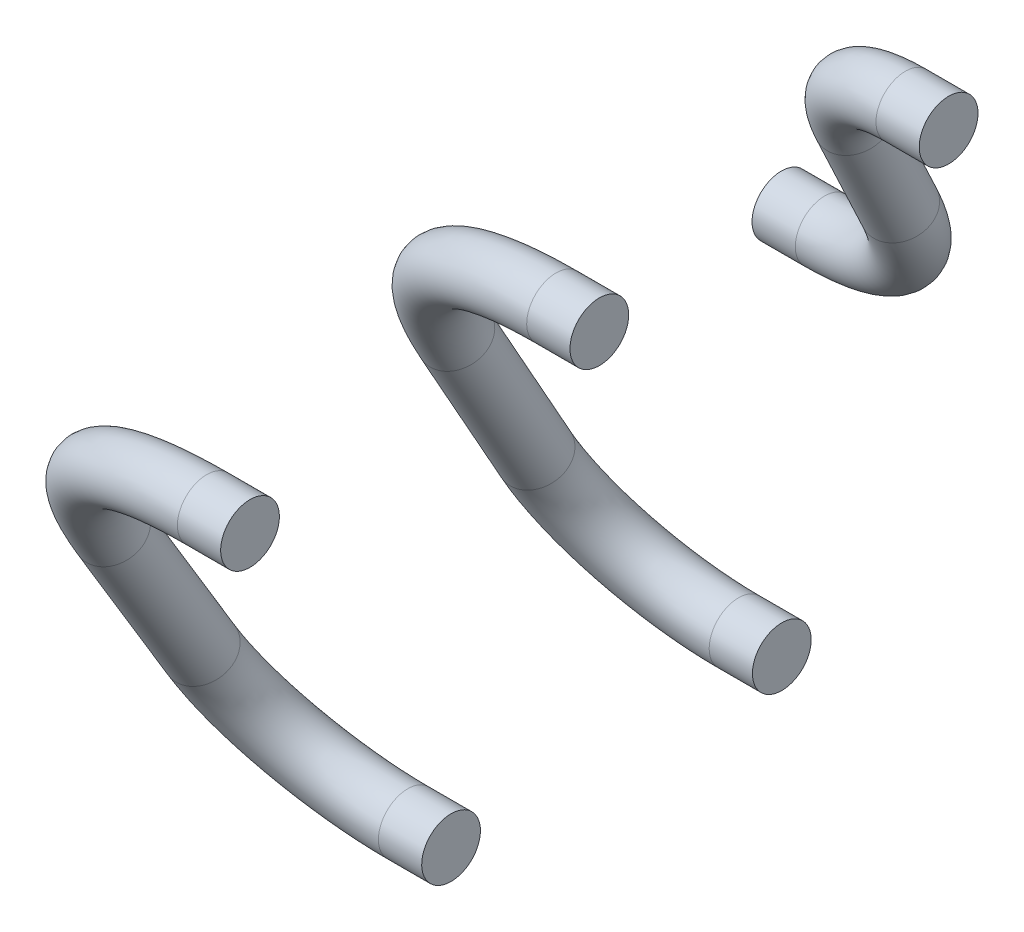
ISO-10303-21;
HEADER;
FILE_DESCRIPTION(('STEP AP214'),'2;1');
FILE_NAME('part.step','',(''),(''),'','','');
FILE_SCHEMA(('AUTOMOTIVE_DESIGN { 1 0 10303 214 1 1 1 1 }'));
ENDSEC;
DATA;
#1=APPLICATION_CONTEXT('core data for automotive mechanical design processes');
#2=APPLICATION_PROTOCOL_DEFINITION('international standard','automotive_design',2000,#1);
#3=PRODUCT_CONTEXT('',#1,'mechanical');
#4=PRODUCT('Part','Part','',(#3));
#5=PRODUCT_RELATED_PRODUCT_CATEGORY('part','',(#4));
#6=PRODUCT_DEFINITION_FORMATION('','',#4);
#7=PRODUCT_DEFINITION_CONTEXT('part definition',#1,'design');
#8=PRODUCT_DEFINITION('design','',#6,#7);
#9=PRODUCT_DEFINITION_SHAPE('','',#8);
#10=(LENGTH_UNIT() NAMED_UNIT(*) SI_UNIT(.MILLI.,.METRE.));
#11=(NAMED_UNIT(*) PLANE_ANGLE_UNIT() SI_UNIT($,.RADIAN.));
#12=(NAMED_UNIT(*) SI_UNIT($,.STERADIAN.) SOLID_ANGLE_UNIT());
#13=UNCERTAINTY_MEASURE_WITH_UNIT(LENGTH_MEASURE(1.E-05),#10,'distance_accuracy_value','');
#14=(GEOMETRIC_REPRESENTATION_CONTEXT(3) GLOBAL_UNCERTAINTY_ASSIGNED_CONTEXT((#13)) GLOBAL_UNIT_ASSIGNED_CONTEXT((#10,
#11,#12)) REPRESENTATION_CONTEXT('',''));
#15=CARTESIAN_POINT('',(0.,0.,0.));
#16=DIRECTION('',(0.,0.,1.));
#17=DIRECTION('',(1.,0.,0.));
#18=AXIS2_PLACEMENT_3D('',#15,#16,#17);
#19=CARTESIAN_POINT('',(-135.683849371952,-35.0000000000001,26.75));
#20=DIRECTION('',(-1.,0.,0.));
#21=DIRECTION('',(0.,0.884808481596098,-0.465954880750923));
#22=AXIS2_PLACEMENT_3D('',#19,#20,#21);
#23=PLANE('',#22);
#24=CARTESIAN_POINT('',(-135.683849371952,-35.0000000000001,26.75));
#25=DIRECTION('',(-1.,0.,0.));
#26=DIRECTION('',(0.,0.884808481596098,-0.465954880750923));
#27=AXIS2_PLACEMENT_3D('',#24,#25,#26);
#28=CIRCLE('',#27,4.75000000000001);
#29=CARTESIAN_POINT('',(-135.683849371952,-30.7971597124186,24.5367143164331));
#30=VERTEX_POINT('',#29);
#31=EDGE_CURVE('E56',#30,#30,#28,.T.);
#32=ORIENTED_EDGE('',*,*,#31,.F.);
#33=EDGE_LOOP('',(#32));
#34=FACE_BOUND('',#33,.T.);
#35=ADVANCED_FACE('F44',(#34),#23,.F.);
#36=CARTESIAN_POINT('',(-125.95,34.9999999999997,69.0000000000001));
#37=DIRECTION('',(1.,0.,0.));
#38=DIRECTION('',(0.,0.,-1.));
#39=AXIS2_PLACEMENT_3D('',#36,#37,#38);
#40=PLANE('',#39);
#41=CARTESIAN_POINT('',(-125.95,34.9999999999997,69.0000000000001));
#42=DIRECTION('',(1.,0.,0.));
#43=DIRECTION('',(0.,0.,-1.));
#44=AXIS2_PLACEMENT_3D('',#41,#42,#43);
#45=CIRCLE('',#44,4.75000000000001);
#46=CARTESIAN_POINT('',(-125.95,34.9999999999997,64.2500000000001));
#47=VERTEX_POINT('',#46);
#48=EDGE_CURVE('E12',#47,#47,#45,.T.);
#49=ORIENTED_EDGE('',*,*,#48,.T.);
#50=EDGE_LOOP('',(#49));
#51=FACE_BOUND('',#50,.T.);
#52=ADVANCED_FACE('F59',(#51),#40,.T.);
#53=CARTESIAN_POINT('',(-135.683849371952,-35.0000000000001,26.75));
#54=DIRECTION('',(-1.,0.,0.));
#55=DIRECTION('',(0.,0.,1.));
#56=AXIS2_PLACEMENT_3D('',#53,#54,#55);
#57=CYLINDRICAL_SURFACE('',#56,4.75000000000001);
#58=CARTESIAN_POINT('',(-142.683849371952,-35.0000000000001,26.75));
#59=DIRECTION('',(-1.,0.,0.));
#60=DIRECTION('',(0.,0.884808481596098,-0.465954880750923));
#61=AXIS2_PLACEMENT_3D('',#58,#59,#60);
#62=CIRCLE('',#61,4.75000000000001);
#63=CARTESIAN_POINT('',(-142.683849371952,-39.0666698290459,24.2954742817545));
#64=VERTEX_POINT('',#63);
#65=EDGE_CURVE('E76',#64,#64,#62,.T.);
#66=ORIENTED_EDGE('',*,*,#65,.F.);
#67=EDGE_LOOP('',(#66));
#68=FACE_BOUND('',#67,.T.);
#69=ORIENTED_EDGE('',*,*,#31,.T.);
#70=EDGE_LOOP('',(#69));
#71=FACE_BOUND('',#70,.T.);
#72=ADVANCED_FACE('F80',(#68,#71),#57,.T.);
#73=CARTESIAN_POINT('',(-142.683849371952,-16.1648976338932,38.1183296424002));
#74=DIRECTION('',(0.,0.516742256472739,-0.85614101664122));
#75=DIRECTION('',(0.,0.85614101664122,0.516742256472739));
#76=AXIS2_PLACEMENT_3D('',#73,#74,#75);
#77=TOROIDAL_SURFACE('',#76,22.,4.75000000000001);
#78=CARTESIAN_POINT('',(-164.683849371952,-16.1648976338932,38.1183296424002));
#79=DIRECTION('',(0.,0.85614101664122,0.516742256472739));
#80=DIRECTION('',(0.516742256472739,0.442404240798049,-0.732977440375462));
#81=AXIS2_PLACEMENT_3D('',#78,#79,#80);
#82=CIRCLE('',#81,4.75000000000001);
#83=CARTESIAN_POINT('',(-169.433849371952,-16.1648976338932,38.1183296424002));
#84=VERTEX_POINT('',#83);
#85=EDGE_CURVE('E71',#84,#84,#82,.T.);
#86=CARTESIAN_POINT('',(-142.683849371952,-16.1648976338932,38.1183296424002));
#87=DIRECTION('',(0.,0.516742256472739,-0.85614101664122));
#88=DIRECTION('',(0.,0.85614101664122,0.516742256472739));
#89=AXIS2_PLACEMENT_3D('',#86,#87,#88);
#90=CIRCLE('',#89,26.75);
#91=EDGE_CURVE('',#64,#84,#90,.T.);
#92=ORIENTED_EDGE('',*,*,#65,.T.);
#93=ORIENTED_EDGE('',*,*,#85,.F.);
#94=ORIENTED_EDGE('',*,*,#91,.T.);
#95=ORIENTED_EDGE('',*,*,#91,.F.);
#96=EDGE_LOOP('',(#92,#94,#93,#95));
#97=FACE_BOUND('',#96,.T.);
#98=ADVANCED_FACE('F82',(#97),#77,.T.);
#99=CARTESIAN_POINT('',(-164.683849371952,-16.1648976338932,38.1183296424002));
#100=DIRECTION('',(0.,0.85614101664122,0.516742256472739));
#101=DIRECTION('',(0.,-0.516742256472739,0.85614101664122));
#102=AXIS2_PLACEMENT_3D('',#99,#100,#101);
#103=CYLINDRICAL_SURFACE('',#102,4.75000000000001);
#104=CARTESIAN_POINT('',(-164.683849371952,7.8313499367573,52.6017790689715));
#105=DIRECTION('',(0.,0.85614101664122,0.516742256472739));
#106=DIRECTION('',(0.516742256472739,0.44240424079805,-0.732977440375461));
#107=AXIS2_PLACEMENT_3D('',#104,#105,#106);
#108=CIRCLE('',#107,4.75000000000001);
#109=CARTESIAN_POINT('',(-169.433849371952,7.83134993675729,52.6017790689715));
#110=VERTEX_POINT('',#109);
#111=EDGE_CURVE('E69',#110,#110,#108,.T.);
#112=ORIENTED_EDGE('',*,*,#111,.F.);
#113=EDGE_LOOP('',(#112));
#114=FACE_BOUND('',#113,.T.);
#115=ORIENTED_EDGE('',*,*,#85,.T.);
#116=EDGE_LOOP('',(#115));
#117=FACE_BOUND('',#116,.T.);
#118=ADVANCED_FACE('F89',(#114,#117),#103,.T.);
#119=CARTESIAN_POINT('',(-132.95,7.83134993675732,52.6017790689715));
#120=DIRECTION('',(0.,0.516742256472739,-0.85614101664122));
#121=DIRECTION('',(0.,0.85614101664122,0.516742256472739));
#122=AXIS2_PLACEMENT_3D('',#119,#120,#121);
#123=TOROIDAL_SURFACE('',#122,31.7338493719521,4.75000000000001);
#124=CARTESIAN_POINT('',(-132.95,34.9999999999997,69.0000000000001));
#125=DIRECTION('',(1.,0.,0.));
#126=DIRECTION('',(0.,0.,-1.));
#127=AXIS2_PLACEMENT_3D('',#124,#125,#126);
#128=CIRCLE('',#127,4.75000000000001);
#129=CARTESIAN_POINT('',(-132.95,39.0666698290455,71.4545257182456));
#130=VERTEX_POINT('',#129);
#131=EDGE_CURVE('E51',#130,#130,#128,.T.);
#132=CARTESIAN_POINT('',(-132.95,7.83134993675732,52.6017790689715));
#133=DIRECTION('',(0.,0.516742256472739,-0.85614101664122));
#134=DIRECTION('',(0.,0.85614101664122,0.516742256472739));
#135=AXIS2_PLACEMENT_3D('',#132,#133,#134);
#136=CIRCLE('',#135,36.4838493719521);
#137=EDGE_CURVE('',#110,#130,#136,.T.);
#138=ORIENTED_EDGE('',*,*,#111,.T.);
#139=ORIENTED_EDGE('',*,*,#131,.F.);
#140=ORIENTED_EDGE('',*,*,#137,.T.);
#141=ORIENTED_EDGE('',*,*,#137,.F.);
#142=EDGE_LOOP('',(#138,#140,#139,#141));
#143=FACE_BOUND('',#142,.T.);
#144=ADVANCED_FACE('F64',(#143),#123,.T.);
#145=CARTESIAN_POINT('',(-132.95,34.9999999999997,69.0000000000001));
#146=DIRECTION('',(1.,0.,0.));
#147=DIRECTION('',(0.,0.,-1.));
#148=AXIS2_PLACEMENT_3D('',#145,#146,#147);
#149=CYLINDRICAL_SURFACE('',#148,4.75000000000001);
#150=ORIENTED_EDGE('',*,*,#48,.F.);
#151=EDGE_LOOP('',(#150));
#152=FACE_BOUND('',#151,.T.);
#153=ORIENTED_EDGE('',*,*,#131,.T.);
#154=EDGE_LOOP('',(#153));
#155=FACE_BOUND('',#154,.T.);
#156=ADVANCED_FACE('F61',(#152,#155),#149,.T.);
#157=CLOSED_SHELL('',(#35,#52,#72,#98,#118,#144,#156));
#158=MANIFOLD_SOLID_BREP('B2',#157);
#159=CARTESIAN_POINT('',(-125.95,34.9999999999999,12.5000000000001));
#160=DIRECTION('',(1.,0.,0.));
#161=DIRECTION('',(0.,0.,-1.));
#162=AXIS2_PLACEMENT_3D('',#159,#160,#161);
#163=PLANE('',#162);
#164=CARTESIAN_POINT('',(-125.95,34.9999999999999,12.5000000000001));
#165=DIRECTION('',(1.,0.,0.));
#166=DIRECTION('',(0.,0.,-1.));
#167=AXIS2_PLACEMENT_3D('',#164,#165,#166);
#168=CIRCLE('',#167,4.75);
#169=CARTESIAN_POINT('',(-125.95,34.9999999999999,7.75000000000006));
#170=VERTEX_POINT('',#169);
#171=EDGE_CURVE('E168',#170,#170,#168,.T.);
#172=ORIENTED_EDGE('',*,*,#171,.T.);
#173=EDGE_LOOP('',(#172));
#174=FACE_BOUND('',#173,.T.);
#175=ADVANCED_FACE('F156',(#174),#163,.T.);
#176=CARTESIAN_POINT('',(-135.683849371952,-34.9999999999999,-26.75));
#177=DIRECTION('',(-1.,0.,0.));
#178=DIRECTION('',(0.,0.8531863482421,-0.521606226164249));
#179=AXIS2_PLACEMENT_3D('',#176,#177,#178);
#180=PLANE('',#179);
#181=CARTESIAN_POINT('',(-135.683849371952,-34.9999999999999,-26.75));
#182=DIRECTION('',(-1.,0.,0.));
#183=DIRECTION('',(0.,0.8531863482421,-0.521606226164249));
#184=AXIS2_PLACEMENT_3D('',#181,#182,#183);
#185=CIRCLE('',#184,4.75);
#186=CARTESIAN_POINT('',(-135.683849371952,-30.94736484585,-29.2276295742802));
#187=VERTEX_POINT('',#186);
#188=EDGE_CURVE('E42',#187,#187,#185,.T.);
#189=ORIENTED_EDGE('',*,*,#188,.F.);
#190=EDGE_LOOP('',(#189));
#191=FACE_BOUND('',#190,.T.);
#192=ADVANCED_FACE('F174',(#191),#180,.F.);
#193=CARTESIAN_POINT('',(-125.95,34.9999999999999,12.5000000000001));
#194=DIRECTION('',(-1.,0.,0.));
#195=DIRECTION('',(0.,-1.,0.));
#196=AXIS2_PLACEMENT_3D('',#193,#194,#195);
#197=CYLINDRICAL_SURFACE('',#196,4.75);
#198=CARTESIAN_POINT('',(-132.95,34.9999999999999,12.5000000000001));
#199=DIRECTION('',(1.,0.,0.));
#200=DIRECTION('',(0.,0.,-1.));
#201=AXIS2_PLACEMENT_3D('',#198,#199,#200);
#202=CIRCLE('',#201,4.75);
#203=CARTESIAN_POINT('',(-132.95,39.1431413491352,14.8231185421938));
#204=VERTEX_POINT('',#203);
#205=EDGE_CURVE('E208',#204,#204,#202,.T.);
#206=ORIENTED_EDGE('',*,*,#205,.T.);
#207=EDGE_LOOP('',(#206));
#208=FACE_BOUND('',#207,.T.);
#209=ORIENTED_EDGE('',*,*,#171,.F.);
#210=EDGE_LOOP('',(#209));
#211=FACE_BOUND('',#210,.T.);
#212=ADVANCED_FACE('F176',(#208,#211),#197,.T.);
#213=CARTESIAN_POINT('',(-132.95,7.32045821049073,-3.02031450340329));
#214=DIRECTION('',(0.,-0.48907758783027,0.872240284028504));
#215=DIRECTION('',(0.,-0.872240284028504,-0.48907758783027));
#216=AXIS2_PLACEMENT_3D('',#213,#214,#215);
#217=TOROIDAL_SURFACE('',#216,31.7338493719518,4.75);
#218=CARTESIAN_POINT('',(-164.683849371952,7.32045821049074,-3.02031450340329));
#219=DIRECTION('',(0.,0.872240284028503,0.489077587830271));
#220=DIRECTION('',(0.489077587830269,0.426593174121051,-0.760803113082125));
#221=AXIS2_PLACEMENT_3D('',#218,#219,#220);
#222=CIRCLE('',#221,4.75);
#223=CARTESIAN_POINT('',(-169.433849371952,7.32045821049074,-3.02031450340329));
#224=VERTEX_POINT('',#223);
#225=EDGE_CURVE('E205',#224,#224,#222,.T.);
#226=CARTESIAN_POINT('',(-132.95,7.32045821049073,-3.02031450340329));
#227=DIRECTION('',(0.,-0.48907758783027,0.872240284028504));
#228=DIRECTION('',(0.,-0.872240284028504,-0.48907758783027));
#229=AXIS2_PLACEMENT_3D('',#226,#227,#228);
#230=CIRCLE('',#229,36.4838493719518);
#231=EDGE_CURVE('',#204,#224,#230,.T.);
#232=ORIENTED_EDGE('',*,*,#205,.F.);
#233=ORIENTED_EDGE('',*,*,#225,.T.);
#234=ORIENTED_EDGE('',*,*,#231,.T.);
#235=ORIENTED_EDGE('',*,*,#231,.F.);
#236=EDGE_LOOP('',(#232,#234,#233,#235));
#237=FACE_BOUND('',#236,.T.);
#238=ADVANCED_FACE('F181',(#237),#217,.T.);
#239=CARTESIAN_POINT('',(-164.683849371952,7.32045821049075,-3.02031450340329));
#240=DIRECTION('',(0.,-0.872240284028504,-0.48907758783027));
#241=DIRECTION('',(0.,0.48907758783027,-0.872240284028504));
#242=AXIS2_PLACEMENT_3D('',#239,#240,#241);
#243=CYLINDRICAL_SURFACE('',#242,4.75);
#244=CARTESIAN_POINT('',(-164.683849371952,-15.8107137513729,-15.990293067734));
#245=DIRECTION('',(0.,0.872240284028503,0.489077587830271));
#246=DIRECTION('',(0.489077587830269,0.426593174121051,-0.760803113082124));
#247=AXIS2_PLACEMENT_3D('',#244,#245,#246);
#248=CIRCLE('',#247,4.75);
#249=CARTESIAN_POINT('',(-169.433849371952,-15.8107137513729,-15.990293067734));
#250=VERTEX_POINT('',#249);
#251=EDGE_CURVE('E210',#250,#250,#248,.T.);
#252=ORIENTED_EDGE('',*,*,#251,.T.);
#253=EDGE_LOOP('',(#252));
#254=FACE_BOUND('',#253,.T.);
#255=ORIENTED_EDGE('',*,*,#225,.F.);
#256=EDGE_LOOP('',(#255));
#257=FACE_BOUND('',#256,.T.);
#258=ADVANCED_FACE('F191',(#254,#257),#243,.T.);
#259=CARTESIAN_POINT('',(-142.683849371952,-15.8107137513729,-15.990293067734));
#260=DIRECTION('',(0.,-0.48907758783027,0.872240284028504));
#261=DIRECTION('',(0.,-0.872240284028504,-0.48907758783027));
#262=AXIS2_PLACEMENT_3D('',#259,#260,#261);
#263=TOROIDAL_SURFACE('',#262,22.,4.75);
#264=CARTESIAN_POINT('',(-142.683849371952,-34.9999999999999,-26.75));
#265=DIRECTION('',(-1.,0.,0.));
#266=DIRECTION('',(0.,0.8531863482421,-0.521606226164249));
#267=AXIS2_PLACEMENT_3D('',#264,#265,#266);
#268=CIRCLE('',#267,4.75);
#269=CARTESIAN_POINT('',(-142.683849371952,-39.1431413491353,-29.0731185421938));
#270=VERTEX_POINT('',#269);
#271=EDGE_CURVE('E163',#270,#270,#268,.T.);
#272=CARTESIAN_POINT('',(-142.683849371952,-15.8107137513729,-15.990293067734));
#273=DIRECTION('',(0.,-0.48907758783027,0.872240284028504));
#274=DIRECTION('',(0.,-0.872240284028504,-0.48907758783027));
#275=AXIS2_PLACEMENT_3D('',#272,#273,#274);
#276=CIRCLE('',#275,26.75);
#277=EDGE_CURVE('',#250,#270,#276,.T.);
#278=ORIENTED_EDGE('',*,*,#251,.F.);
#279=ORIENTED_EDGE('',*,*,#271,.T.);
#280=ORIENTED_EDGE('',*,*,#277,.T.);
#281=ORIENTED_EDGE('',*,*,#277,.F.);
#282=EDGE_LOOP('',(#278,#280,#279,#281));
#283=FACE_BOUND('',#282,.T.);
#284=ADVANCED_FACE('F187',(#283),#263,.T.);
#285=CARTESIAN_POINT('',(-142.683849371952,-34.9999999999999,-26.75));
#286=DIRECTION('',(1.,0.,0.));
#287=DIRECTION('',(0.,0.,-1.));
#288=AXIS2_PLACEMENT_3D('',#285,#286,#287);
#289=CYLINDRICAL_SURFACE('',#288,4.75);
#290=ORIENTED_EDGE('',*,*,#188,.T.);
#291=EDGE_LOOP('',(#290));
#292=FACE_BOUND('',#291,.T.);
#293=ORIENTED_EDGE('',*,*,#271,.F.);
#294=EDGE_LOOP('',(#293));
#295=FACE_BOUND('',#294,.T.);
#296=ADVANCED_FACE('F171',(#292,#295),#289,.T.);
#297=CLOSED_SHELL('',(#175,#192,#212,#238,#258,#284,#296));
#298=MANIFOLD_SOLID_BREP('B6',#297);
#299=CARTESIAN_POINT('',(-125.95,35.0000000000001,-44.));
#300=DIRECTION('',(1.,0.,0.));
#301=DIRECTION('',(0.,0.,-1.));
#302=AXIS2_PLACEMENT_3D('',#299,#300,#301);
#303=PLANE('',#302);
#304=CARTESIAN_POINT('',(-125.95,35.0000000000001,-44.));
#305=DIRECTION('',(1.,0.,0.));
#306=DIRECTION('',(0.,0.,-1.));
#307=AXIS2_PLACEMENT_3D('',#304,#305,#306);
#308=CIRCLE('',#307,4.75000000000001);
#309=CARTESIAN_POINT('',(-125.95,35.0000000000001,-48.75));
#310=VERTEX_POINT('',#309);
#311=EDGE_CURVE('E271',#310,#310,#308,.T.);
#312=ORIENTED_EDGE('',*,*,#311,.T.);
#313=EDGE_LOOP('',(#312));
#314=FACE_BOUND('',#313,.T.);
#315=ADVANCED_FACE('F259',(#314),#303,.T.);
#316=CARTESIAN_POINT('',(-176.5,-12.5,-67.5));
#317=DIRECTION('',(1.,0.,0.));
#318=DIRECTION('',(0.,0.,-1.));
#319=AXIS2_PLACEMENT_3D('',#316,#317,#318);
#320=PLANE('',#319);
#321=CARTESIAN_POINT('',(-176.5,-12.5,-67.5));
#322=DIRECTION('',(1.,0.,0.));
#323=DIRECTION('',(0.,0.,-1.));
#324=AXIS2_PLACEMENT_3D('',#321,#322,#323);
#325=CIRCLE('',#324,4.75000000000001);
#326=CARTESIAN_POINT('',(-176.5,-12.5,-72.25));
#327=VERTEX_POINT('',#326);
#328=EDGE_CURVE('E154',#327,#327,#325,.T.);
#329=ORIENTED_EDGE('',*,*,#328,.F.);
#330=EDGE_LOOP('',(#329));
#331=FACE_BOUND('',#330,.T.);
#332=ADVANCED_FACE('F277',(#331),#320,.F.);
#333=CARTESIAN_POINT('',(-125.95,35.0000000000001,-44.));
#334=DIRECTION('',(-1.,0.,0.));
#335=DIRECTION('',(0.,-1.,0.));
#336=AXIS2_PLACEMENT_3D('',#333,#334,#335);
#337=CYLINDRICAL_SURFACE('',#336,4.75000000000001);
#338=CARTESIAN_POINT('',(-132.95,35.0000000000001,-44.));
#339=DIRECTION('',(1.,0.,0.));
#340=DIRECTION('',(0.,0.,-1.));
#341=AXIS2_PLACEMENT_3D('',#338,#339,#340);
#342=CIRCLE('',#341,4.75000000000001);
#343=CARTESIAN_POINT('',(-132.95,39.2574544004868,-41.8936804544961));
#344=VERTEX_POINT('',#343);
#345=EDGE_CURVE('E311',#344,#344,#342,.T.);
#346=ORIENTED_EDGE('',*,*,#345,.T.);
#347=EDGE_LOOP('',(#346));
#348=FACE_BOUND('',#347,.T.);
#349=ORIENTED_EDGE('',*,*,#311,.F.);
#350=EDGE_LOOP('',(#349));
#351=FACE_BOUND('',#350,.T.);
#352=ADVANCED_FACE('F279',(#348,#351),#337,.T.);
#353=CARTESIAN_POINT('',(-132.95,21.8782071816028,-50.4918343417333));
#354=DIRECTION('',(0.,-0.443435693790348,0.896306189576237));
#355=DIRECTION('',(0.,-0.896306189576237,-0.443435693790348));
#356=AXIS2_PLACEMENT_3D('',#353,#354,#355);
#357=TOROIDAL_SURFACE('',#356,14.6398551867646,4.75000000000001);
#358=CARTESIAN_POINT('',(-147.576268199243,22.4434051386856,-50.2122100892819));
#359=DIRECTION('',(0.0430732267232877,0.895474343847034,0.443024149061164));
#360=DIRECTION('',(0.443024149061163,0.380334524005743,-0.811834498649791));
#361=AXIS2_PLACEMENT_3D('',#358,#359,#360);
#362=CIRCLE('',#361,4.75000000000001);
#363=CARTESIAN_POINT('',(-152.321859809276,22.6267874373419,-50.1214841099467));
#364=VERTEX_POINT('',#363);
#365=EDGE_CURVE('E308',#364,#364,#362,.T.);
#366=CARTESIAN_POINT('',(-132.95,21.8782071816028,-50.4918343417333));
#367=DIRECTION('',(0.,-0.443435693790348,0.896306189576237));
#368=DIRECTION('',(0.,-0.896306189576237,-0.443435693790348));
#369=AXIS2_PLACEMENT_3D('',#366,#367,#368);
#370=CIRCLE('',#369,19.3898551867646);
#371=EDGE_CURVE('',#344,#364,#370,.T.);
#372=ORIENTED_EDGE('',*,*,#345,.F.);
#373=ORIENTED_EDGE('',*,*,#365,.T.);
#374=ORIENTED_EDGE('',*,*,#371,.T.);
#375=ORIENTED_EDGE('',*,*,#371,.F.);
#376=EDGE_LOOP('',(#372,#374,#373,#375));
#377=FACE_BOUND('',#376,.T.);
#378=ADVANCED_FACE('F284',(#377),#357,.T.);
#379=CARTESIAN_POINT('',(-147.576268199243,22.4434051386857,-50.2122100892819));
#380=DIRECTION('',(-0.043073226723288,-0.895474343847034,-0.443024149061163));
#381=DIRECTION('',(0.,0.443435693790348,-0.896306189576237));
#382=AXIS2_PLACEMENT_3D('',#379,#380,#381);
#383=CYLINDRICAL_SURFACE('',#382,4.75000000000001);
#384=CARTESIAN_POINT('',(-148.385153710328,5.62701413693875,-58.5318982690935));
#385=DIRECTION('',(0.0430732267232889,0.895474343847034,0.443024149061164));
#386=DIRECTION('',(0.443024149061163,0.380334524005743,-0.811834498649791));
#387=AXIS2_PLACEMENT_3D('',#384,#385,#386);
#388=CIRCLE('',#387,4.75000000000001);
#389=CARTESIAN_POINT('',(-143.639562100295,5.44363183828253,-58.6226242484287));
#390=VERTEX_POINT('',#389);
#391=EDGE_CURVE('E313',#390,#390,#388,.T.);
#392=ORIENTED_EDGE('',*,*,#391,.T.);
#393=EDGE_LOOP('',(#392));
#394=FACE_BOUND('',#393,.T.);
#395=ORIENTED_EDGE('',*,*,#365,.F.);
#396=EDGE_LOOP('',(#395));
#397=FACE_BOUND('',#396,.T.);
#398=ADVANCED_FACE('F294',(#394,#397),#383,.T.);
#399=CARTESIAN_POINT('',(-169.5,6.44294803234326,-58.1282257103144));
#400=DIRECTION('',(0.,0.443435693790348,-0.896306189576237));
#401=DIRECTION('',(0.,0.896306189576237,0.443435693790348));
#402=AXIS2_PLACEMENT_3D('',#399,#400,#401);
#403=TOROIDAL_SURFACE('',#402,21.1344608044035,4.75000000000001);
#404=CARTESIAN_POINT('',(-169.5,-12.5000000000002,-67.5));
#405=DIRECTION('',(1.,0.,0.));
#406=DIRECTION('',(0.,0.,-1.));
#407=AXIS2_PLACEMENT_3D('',#404,#405,#406);
#408=CIRCLE('',#407,4.75000000000001);
#409=CARTESIAN_POINT('',(-169.5,-16.7574544004872,-69.606319545504));
#410=VERTEX_POINT('',#409);
#411=EDGE_CURVE('E266',#410,#410,#408,.T.);
#412=CARTESIAN_POINT('',(-169.5,6.44294803234326,-58.1282257103144));
#413=DIRECTION('',(0.,0.443435693790348,-0.896306189576237));
#414=DIRECTION('',(0.,0.896306189576237,0.443435693790348));
#415=AXIS2_PLACEMENT_3D('',#412,#413,#414);
#416=CIRCLE('',#415,25.8844608044035);
#417=EDGE_CURVE('',#390,#410,#416,.T.);
#418=ORIENTED_EDGE('',*,*,#391,.F.);
#419=ORIENTED_EDGE('',*,*,#411,.T.);
#420=ORIENTED_EDGE('',*,*,#417,.T.);
#421=ORIENTED_EDGE('',*,*,#417,.F.);
#422=EDGE_LOOP('',(#418,#420,#419,#421));
#423=FACE_BOUND('',#422,.T.);
#424=ADVANCED_FACE('F290',(#423),#403,.T.);
#425=CARTESIAN_POINT('',(-169.5,-12.5,-67.5));
#426=DIRECTION('',(-1.,0.,0.));
#427=DIRECTION('',(0.,-1.,0.));
#428=AXIS2_PLACEMENT_3D('',#425,#426,#427);
#429=CYLINDRICAL_SURFACE('',#428,4.75000000000001);
#430=ORIENTED_EDGE('',*,*,#328,.T.);
#431=EDGE_LOOP('',(#430));
#432=FACE_BOUND('',#431,.T.);
#433=ORIENTED_EDGE('',*,*,#411,.F.);
#434=EDGE_LOOP('',(#433));
#435=FACE_BOUND('',#434,.T.);
#436=ADVANCED_FACE('F274',(#432,#435),#429,.T.);
#437=CLOSED_SHELL('',(#315,#332,#352,#378,#398,#424,#436));
#438=MANIFOLD_SOLID_BREP('B36',#437);
#439=ADVANCED_BREP_SHAPE_REPRESENTATION('',(#18,#158,#298,#438),#14);
#440=SHAPE_DEFINITION_REPRESENTATION(#9,#439);
ENDSEC;
END-ISO-10303-21;
